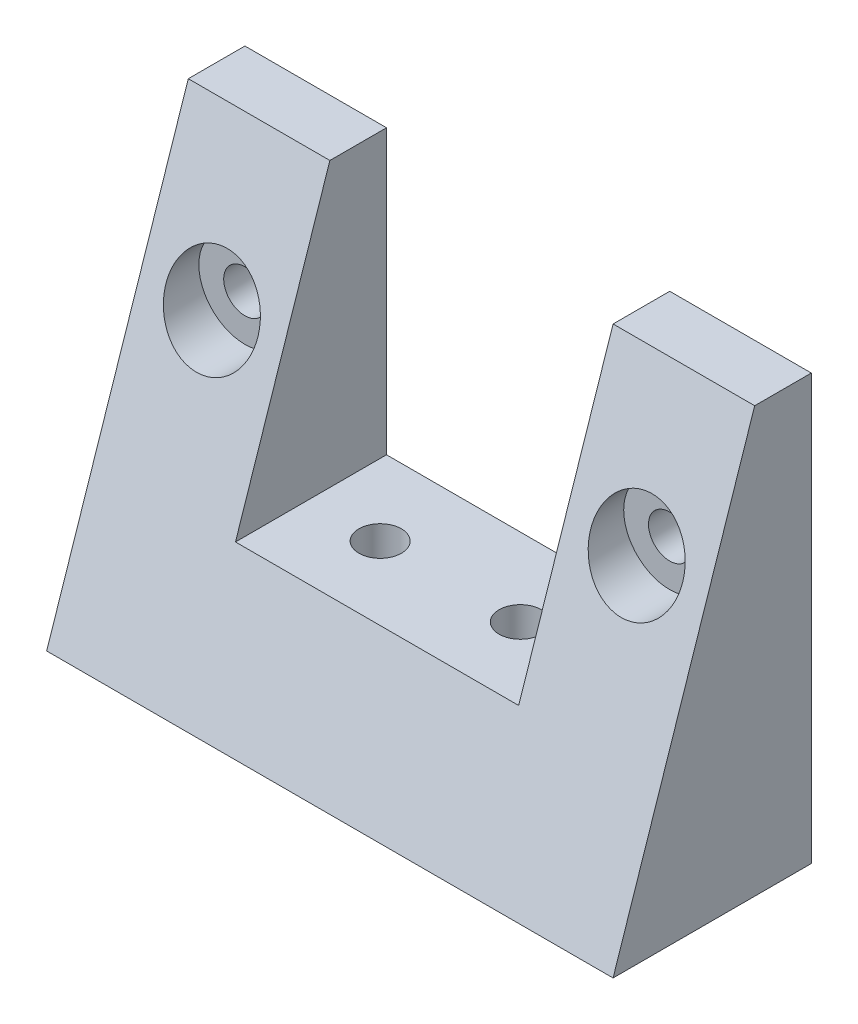
ISO-10303-21;
HEADER;
FILE_DESCRIPTION(('STEP AP214'),'2;1');
FILE_NAME('part.step','',(''),(''),'','','');
FILE_SCHEMA(('AUTOMOTIVE_DESIGN { 1 0 10303 214 1 1 1 1 }'));
ENDSEC;
DATA;
#1=APPLICATION_CONTEXT('core data for automotive mechanical design processes');
#2=APPLICATION_PROTOCOL_DEFINITION('international standard','automotive_design',2000,#1);
#3=PRODUCT_CONTEXT('',#1,'mechanical');
#4=PRODUCT('Part','Part','',(#3));
#5=PRODUCT_RELATED_PRODUCT_CATEGORY('part','',(#4));
#6=PRODUCT_DEFINITION_FORMATION('','',#4);
#7=PRODUCT_DEFINITION_CONTEXT('part definition',#1,'design');
#8=PRODUCT_DEFINITION('design','',#6,#7);
#9=PRODUCT_DEFINITION_SHAPE('','',#8);
#10=(LENGTH_UNIT() NAMED_UNIT(*) SI_UNIT(.MILLI.,.METRE.));
#11=(NAMED_UNIT(*) PLANE_ANGLE_UNIT() SI_UNIT($,.RADIAN.));
#12=(NAMED_UNIT(*) SI_UNIT($,.STERADIAN.) SOLID_ANGLE_UNIT());
#13=UNCERTAINTY_MEASURE_WITH_UNIT(LENGTH_MEASURE(1.E-05),#10,'distance_accuracy_value','');
#14=(GEOMETRIC_REPRESENTATION_CONTEXT(3) GLOBAL_UNCERTAINTY_ASSIGNED_CONTEXT((#13)) GLOBAL_UNIT_ASSIGNED_CONTEXT((#10,
#11,#12)) REPRESENTATION_CONTEXT('',''));
#15=CARTESIAN_POINT('',(0.,0.,0.));
#16=DIRECTION('',(0.,0.,1.));
#17=DIRECTION('',(1.,0.,0.));
#18=AXIS2_PLACEMENT_3D('',#15,#16,#17);
#19=CARTESIAN_POINT('',(-40.,30.,4.));
#20=DIRECTION('',(0.,1.,0.));
#21=DIRECTION('',(0.,0.,1.));
#22=AXIS2_PLACEMENT_3D('',#19,#20,#21);
#23=PLANE('',#22);
#24=DIRECTION('',(0.,0.,-1.));
#25=VECTOR('',#24,1.);
#26=CARTESIAN_POINT('',(-10.,30.,4.));
#27=LINE('',#26,#25);
#28=CARTESIAN_POINT('',(-10.,30.,4.));
#29=VERTEX_POINT('',#28);
#30=CARTESIAN_POINT('',(-10.,30.,0.));
#31=VERTEX_POINT('',#30);
#32=EDGE_CURVE('E48',#29,#31,#27,.T.);
#33=ORIENTED_EDGE('',*,*,#32,.F.);
#34=DIRECTION('',(1.,0.,0.));
#35=VECTOR('',#34,1.);
#36=CARTESIAN_POINT('',(-40.,30.,4.));
#37=LINE('',#36,#35);
#38=CARTESIAN_POINT('',(0.,30.,4.));
#39=VERTEX_POINT('',#38);
#40=EDGE_CURVE('E170',#29,#39,#37,.T.);
#41=ORIENTED_EDGE('',*,*,#40,.T.);
#42=DIRECTION('',(0.,0.,1.));
#43=VECTOR('',#42,1.);
#44=CARTESIAN_POINT('',(0.,30.,4.));
#45=LINE('',#44,#43);
#46=CARTESIAN_POINT('',(0.,30.,0.));
#47=VERTEX_POINT('',#46);
#48=EDGE_CURVE('E155',#47,#39,#45,.T.);
#49=ORIENTED_EDGE('',*,*,#48,.F.);
#50=DIRECTION('',(1.,0.,0.));
#51=VECTOR('',#50,1.);
#52=CARTESIAN_POINT('',(-40.,30.,0.));
#53=LINE('',#52,#51);
#54=EDGE_CURVE('E152',#31,#47,#53,.T.);
#55=ORIENTED_EDGE('',*,*,#54,.F.);
#56=EDGE_LOOP('',(#33,#41,#49,#55));
#57=FACE_BOUND('',#56,.T.);
#58=ADVANCED_FACE('F39',(#57),#23,.T.);
#59=CARTESIAN_POINT('',(-40.,30.,0.));
#60=DIRECTION('',(0.,0.,-1.));
#61=DIRECTION('',(0.,1.,0.));
#62=AXIS2_PLACEMENT_3D('',#59,#60,#61);
#63=PLANE('',#62);
#64=CARTESIAN_POINT('',(-5.,20.,0.));
#65=DIRECTION('',(0.,0.,-1.));
#66=DIRECTION('',(0.,1.,0.));
#67=AXIS2_PLACEMENT_3D('',#64,#65,#66);
#68=CIRCLE('',#67,1.5);
#69=CARTESIAN_POINT('',(-5.,21.5,0.));
#70=VERTEX_POINT('',#69);
#71=EDGE_CURVE('E130',#70,#70,#68,.T.);
#72=ORIENTED_EDGE('',*,*,#71,.F.);
#73=EDGE_LOOP('',(#72));
#74=FACE_BOUND('',#73,.T.);
#75=CARTESIAN_POINT('',(-35.,20.,0.));
#76=DIRECTION('',(0.,0.,-1.));
#77=DIRECTION('',(0.,-1.,0.));
#78=AXIS2_PLACEMENT_3D('',#75,#76,#77);
#79=CIRCLE('',#78,1.5);
#80=CARTESIAN_POINT('',(-35.,18.5,0.));
#81=VERTEX_POINT('',#80);
#82=EDGE_CURVE('E199',#81,#81,#79,.T.);
#83=ORIENTED_EDGE('',*,*,#82,.F.);
#84=EDGE_LOOP('',(#83));
#85=FACE_BOUND('',#84,.T.);
#86=DIRECTION('',(0.,-1.,0.));
#87=VECTOR('',#86,1.);
#88=CARTESIAN_POINT('',(-10.,30.,0.));
#89=LINE('',#88,#87);
#90=CARTESIAN_POINT('',(-10.,10.,0.));
#91=VERTEX_POINT('',#90);
#92=EDGE_CURVE('E126',#31,#91,#89,.T.);
#93=ORIENTED_EDGE('',*,*,#92,.F.);
#94=ORIENTED_EDGE('',*,*,#54,.T.);
#95=DIRECTION('',(0.,1.,0.));
#96=VECTOR('',#95,1.);
#97=CARTESIAN_POINT('',(0.,30.,0.));
#98=LINE('',#97,#96);
#99=CARTESIAN_POINT('',(0.,0.,0.));
#100=VERTEX_POINT('',#99);
#101=EDGE_CURVE('E141',#100,#47,#98,.T.);
#102=ORIENTED_EDGE('',*,*,#101,.F.);
#103=DIRECTION('',(1.,0.,0.));
#104=VECTOR('',#103,1.);
#105=CARTESIAN_POINT('',(-40.,0.,0.));
#106=LINE('',#105,#104);
#107=CARTESIAN_POINT('',(-40.,0.,0.));
#108=VERTEX_POINT('',#107);
#109=EDGE_CURVE('E65',#108,#100,#106,.T.);
#110=ORIENTED_EDGE('',*,*,#109,.F.);
#111=DIRECTION('',(0.,1.,0.));
#112=VECTOR('',#111,1.);
#113=CARTESIAN_POINT('',(-40.,30.,0.));
#114=LINE('',#113,#112);
#115=CARTESIAN_POINT('',(-40.,30.,0.));
#116=VERTEX_POINT('',#115);
#117=EDGE_CURVE('E142',#108,#116,#114,.T.);
#118=ORIENTED_EDGE('',*,*,#117,.T.);
#119=CARTESIAN_POINT('',(-30.,30.,0.));
#120=VERTEX_POINT('',#119);
#121=EDGE_CURVE('E91',#116,#120,#53,.T.);
#122=ORIENTED_EDGE('',*,*,#121,.T.);
#123=DIRECTION('',(0.,1.,0.));
#124=VECTOR('',#123,1.);
#125=CARTESIAN_POINT('',(-30.,30.,0.));
#126=LINE('',#125,#124);
#127=CARTESIAN_POINT('',(-30.,10.,0.));
#128=VERTEX_POINT('',#127);
#129=EDGE_CURVE('E56',#128,#120,#126,.T.);
#130=ORIENTED_EDGE('',*,*,#129,.F.);
#131=DIRECTION('',(-1.,0.,0.));
#132=VECTOR('',#131,1.);
#133=CARTESIAN_POINT('',(-10.,10.,0.));
#134=LINE('',#133,#132);
#135=EDGE_CURVE('E119',#91,#128,#134,.T.);
#136=ORIENTED_EDGE('',*,*,#135,.F.);
#137=EDGE_LOOP('',(#93,#94,#102,#110,#118,#122,#130,#136));
#138=FACE_BOUND('',#137,.T.);
#139=ADVANCED_FACE('F41',(#74,#85,#138),#63,.T.);
#140=CARTESIAN_POINT('',(-40.,0.,0.));
#141=DIRECTION('',(0.,-1.,0.));
#142=DIRECTION('',(0.,0.,-1.));
#143=AXIS2_PLACEMENT_3D('',#140,#141,#142);
#144=PLANE('',#143);
#145=CARTESIAN_POINT('',(-24.95,0.,5.5));
#146=DIRECTION('',(0.,1.,0.));
#147=DIRECTION('',(0.,0.,1.));
#148=AXIS2_PLACEMENT_3D('',#145,#146,#147);
#149=CIRCLE('',#148,1.5);
#150=CARTESIAN_POINT('',(-24.95,0.,7.));
#151=VERTEX_POINT('',#150);
#152=EDGE_CURVE('E201',#151,#151,#149,.T.);
#153=ORIENTED_EDGE('',*,*,#152,.T.);
#154=EDGE_LOOP('',(#153));
#155=FACE_BOUND('',#154,.T.);
#156=CARTESIAN_POINT('',(-15.05,0.,5.5));
#157=DIRECTION('',(0.,1.,0.));
#158=DIRECTION('',(0.,0.,-1.));
#159=AXIS2_PLACEMENT_3D('',#156,#157,#158);
#160=CIRCLE('',#159,1.5);
#161=CARTESIAN_POINT('',(-15.05,0.,4.));
#162=VERTEX_POINT('',#161);
#163=EDGE_CURVE('E189',#162,#162,#160,.T.);
#164=ORIENTED_EDGE('',*,*,#163,.T.);
#165=EDGE_LOOP('',(#164));
#166=FACE_BOUND('',#165,.T.);
#167=DIRECTION('',(0.,0.,-1.));
#168=VECTOR('',#167,1.);
#169=CARTESIAN_POINT('',(0.,0.,0.));
#170=LINE('',#169,#168);
#171=CARTESIAN_POINT('',(0.,0.,14.));
#172=VERTEX_POINT('',#171);
#173=EDGE_CURVE('E145',#172,#100,#170,.T.);
#174=ORIENTED_EDGE('',*,*,#173,.F.);
#175=DIRECTION('',(1.,0.,0.));
#176=VECTOR('',#175,1.);
#177=CARTESIAN_POINT('',(-40.,0.,14.));
#178=LINE('',#177,#176);
#179=CARTESIAN_POINT('',(-40.,0.,14.));
#180=VERTEX_POINT('',#179);
#181=EDGE_CURVE('E165',#180,#172,#178,.T.);
#182=ORIENTED_EDGE('',*,*,#181,.F.);
#183=DIRECTION('',(0.,0.,-1.));
#184=VECTOR('',#183,1.);
#185=CARTESIAN_POINT('',(-40.,0.,0.));
#186=LINE('',#185,#184);
#187=EDGE_CURVE('E150',#180,#108,#186,.T.);
#188=ORIENTED_EDGE('',*,*,#187,.T.);
#189=ORIENTED_EDGE('',*,*,#109,.T.);
#190=EDGE_LOOP('',(#174,#182,#188,#189));
#191=FACE_BOUND('',#190,.T.);
#192=ADVANCED_FACE('F235',(#155,#166,#191),#144,.T.);
#193=CARTESIAN_POINT('',(-40.,0.,14.));
#194=DIRECTION('',(0.,0.316227766016838,0.948683298050514));
#195=DIRECTION('',(0.,-0.948683298050514,0.316227766016838));
#196=AXIS2_PLACEMENT_3D('',#193,#194,#195);
#197=PLANE('',#196);
#198=CARTESIAN_POINT('',(-5.,20.,7.33333333333333));
#199=DIRECTION('',(0.,0.316227766016838,0.948683298050514));
#200=DIRECTION('',(0.,-0.948683298050514,0.316227766016838));
#201=AXIS2_PLACEMENT_3D('',#198,#199,#200);
#202=ELLIPSE('',#201,3.42580079851574,3.25);
#203=CARTESIAN_POINT('',(-5.,16.75,8.41666666666667));
#204=VERTEX_POINT('',#203);
#205=EDGE_CURVE('E43',#204,#204,#202,.F.);
#206=ORIENTED_EDGE('',*,*,#205,.T.);
#207=EDGE_LOOP('',(#206));
#208=FACE_BOUND('',#207,.T.);
#209=CARTESIAN_POINT('',(-35.,20.,7.33333333333333));
#210=DIRECTION('',(0.,0.316227766016838,0.948683298050514));
#211=DIRECTION('',(0.,-0.948683298050514,0.316227766016838));
#212=AXIS2_PLACEMENT_3D('',#209,#210,#211);
#213=ELLIPSE('',#212,3.42580079851574,3.25);
#214=CARTESIAN_POINT('',(-35.,16.75,8.41666666666667));
#215=VERTEX_POINT('',#214);
#216=EDGE_CURVE('E180',#215,#215,#213,.F.);
#217=ORIENTED_EDGE('',*,*,#216,.T.);
#218=EDGE_LOOP('',(#217));
#219=FACE_BOUND('',#218,.T.);
#220=DIRECTION('',(0.,0.948683298050514,-0.316227766016838));
#221=VECTOR('',#220,1.);
#222=CARTESIAN_POINT('',(-10.,0.,14.));
#223=LINE('',#222,#221);
#224=CARTESIAN_POINT('',(-10.,10.,10.6666666666667));
#225=VERTEX_POINT('',#224);
#226=EDGE_CURVE('E139',#225,#29,#223,.T.);
#227=ORIENTED_EDGE('',*,*,#226,.F.);
#228=DIRECTION('',(1.,0.,0.));
#229=VECTOR('',#228,1.);
#230=CARTESIAN_POINT('',(-40.,10.,10.6666666666667));
#231=LINE('',#230,#229);
#232=CARTESIAN_POINT('',(-30.,10.,10.6666666666667));
#233=VERTEX_POINT('',#232);
#234=EDGE_CURVE('E12',#233,#225,#231,.T.);
#235=ORIENTED_EDGE('',*,*,#234,.F.);
#236=DIRECTION('',(0.,-0.948683298050514,0.316227766016838));
#237=VECTOR('',#236,1.);
#238=CARTESIAN_POINT('',(-30.,0.,14.));
#239=LINE('',#238,#237);
#240=CARTESIAN_POINT('',(-30.,30.,4.));
#241=VERTEX_POINT('',#240);
#242=EDGE_CURVE('E136',#241,#233,#239,.T.);
#243=ORIENTED_EDGE('',*,*,#242,.F.);
#244=CARTESIAN_POINT('',(-40.,30.,4.));
#245=VERTEX_POINT('',#244);
#246=EDGE_CURVE('E167',#245,#241,#37,.T.);
#247=ORIENTED_EDGE('',*,*,#246,.F.);
#248=DIRECTION('',(0.,-0.948683298050514,0.316227766016838));
#249=VECTOR('',#248,1.);
#250=CARTESIAN_POINT('',(-40.,0.,14.));
#251=LINE('',#250,#249);
#252=EDGE_CURVE('E147',#245,#180,#251,.T.);
#253=ORIENTED_EDGE('',*,*,#252,.T.);
#254=ORIENTED_EDGE('',*,*,#181,.T.);
#255=DIRECTION('',(0.,-0.948683298050514,0.316227766016838));
#256=VECTOR('',#255,1.);
#257=CARTESIAN_POINT('',(0.,0.,14.));
#258=LINE('',#257,#256);
#259=EDGE_CURVE('E158',#39,#172,#258,.T.);
#260=ORIENTED_EDGE('',*,*,#259,.F.);
#261=ORIENTED_EDGE('',*,*,#40,.F.);
#262=EDGE_LOOP('',(#227,#235,#243,#247,#253,#254,#260,#261));
#263=FACE_BOUND('',#262,.T.);
#264=ADVANCED_FACE('F240',(#208,#219,#263),#197,.T.);
#265=DIRECTION('',(0.,0.,1.));
#266=VECTOR('',#265,1.);
#267=CARTESIAN_POINT('',(-30.,30.,4.));
#268=LINE('',#267,#266);
#269=EDGE_CURVE('E164',#120,#241,#268,.T.);
#270=ORIENTED_EDGE('',*,*,#269,.F.);
#271=ORIENTED_EDGE('',*,*,#121,.F.);
#272=DIRECTION('',(0.,0.,1.));
#273=VECTOR('',#272,1.);
#274=CARTESIAN_POINT('',(-40.,30.,4.));
#275=LINE('',#274,#273);
#276=EDGE_CURVE('E144',#116,#245,#275,.T.);
#277=ORIENTED_EDGE('',*,*,#276,.T.);
#278=ORIENTED_EDGE('',*,*,#246,.T.);
#279=EDGE_LOOP('',(#270,#271,#277,#278));
#280=FACE_BOUND('',#279,.T.);
#281=ADVANCED_FACE('F243',(#280),#23,.T.);
#282=CARTESIAN_POINT('',(-40.,0.,0.));
#283=DIRECTION('',(-1.,0.,0.));
#284=DIRECTION('',(0.,0.,1.));
#285=AXIS2_PLACEMENT_3D('',#282,#283,#284);
#286=PLANE('',#285);
#287=ORIENTED_EDGE('',*,*,#117,.F.);
#288=ORIENTED_EDGE('',*,*,#187,.F.);
#289=ORIENTED_EDGE('',*,*,#252,.F.);
#290=ORIENTED_EDGE('',*,*,#276,.F.);
#291=EDGE_LOOP('',(#287,#288,#289,#290));
#292=FACE_BOUND('',#291,.T.);
#293=ADVANCED_FACE('F248',(#292),#286,.T.);
#294=CARTESIAN_POINT('',(0.,0.,0.));
#295=DIRECTION('',(-1.,0.,0.));
#296=DIRECTION('',(0.,0.,1.));
#297=AXIS2_PLACEMENT_3D('',#294,#295,#296);
#298=PLANE('',#297);
#299=ORIENTED_EDGE('',*,*,#101,.T.);
#300=ORIENTED_EDGE('',*,*,#48,.T.);
#301=ORIENTED_EDGE('',*,*,#259,.T.);
#302=ORIENTED_EDGE('',*,*,#173,.T.);
#303=EDGE_LOOP('',(#299,#300,#301,#302));
#304=FACE_BOUND('',#303,.T.);
#305=ADVANCED_FACE('F253',(#304),#298,.F.);
#306=CARTESIAN_POINT('',(-10.,30.,14.));
#307=DIRECTION('',(1.,0.,0.));
#308=DIRECTION('',(0.,1.,0.));
#309=AXIS2_PLACEMENT_3D('',#306,#307,#308);
#310=PLANE('',#309);
#311=ORIENTED_EDGE('',*,*,#226,.T.);
#312=ORIENTED_EDGE('',*,*,#32,.T.);
#313=ORIENTED_EDGE('',*,*,#92,.T.);
#314=DIRECTION('',(0.,0.,-1.));
#315=VECTOR('',#314,1.);
#316=CARTESIAN_POINT('',(-10.,10.,14.));
#317=LINE('',#316,#315);
#318=EDGE_CURVE('E114',#225,#91,#317,.T.);
#319=ORIENTED_EDGE('',*,*,#318,.F.);
#320=EDGE_LOOP('',(#311,#312,#313,#319));
#321=FACE_BOUND('',#320,.T.);
#322=ADVANCED_FACE('F127',(#321),#310,.F.);
#323=CARTESIAN_POINT('',(-30.,30.,14.));
#324=DIRECTION('',(-1.,0.,0.));
#325=DIRECTION('',(0.,-1.,0.));
#326=AXIS2_PLACEMENT_3D('',#323,#324,#325);
#327=PLANE('',#326);
#328=ORIENTED_EDGE('',*,*,#242,.T.);
#329=DIRECTION('',(0.,0.,-1.));
#330=VECTOR('',#329,1.);
#331=CARTESIAN_POINT('',(-30.,10.,14.));
#332=LINE('',#331,#330);
#333=EDGE_CURVE('E123',#233,#128,#332,.T.);
#334=ORIENTED_EDGE('',*,*,#333,.T.);
#335=ORIENTED_EDGE('',*,*,#129,.T.);
#336=ORIENTED_EDGE('',*,*,#269,.T.);
#337=EDGE_LOOP('',(#328,#334,#335,#336));
#338=FACE_BOUND('',#337,.T.);
#339=ADVANCED_FACE('F261',(#338),#327,.F.);
#340=CARTESIAN_POINT('',(-10.,10.,14.));
#341=DIRECTION('',(0.,-1.,0.));
#342=DIRECTION('',(0.,0.,-1.));
#343=AXIS2_PLACEMENT_3D('',#340,#341,#342);
#344=PLANE('',#343);
#345=CARTESIAN_POINT('',(-24.95,10.,5.5));
#346=DIRECTION('',(0.,1.,0.));
#347=DIRECTION('',(0.,0.,1.));
#348=AXIS2_PLACEMENT_3D('',#345,#346,#347);
#349=CIRCLE('',#348,1.5);
#350=CARTESIAN_POINT('',(-24.95,10.,7.));
#351=VERTEX_POINT('',#350);
#352=EDGE_CURVE('E194',#351,#351,#349,.T.);
#353=ORIENTED_EDGE('',*,*,#352,.F.);
#354=EDGE_LOOP('',(#353));
#355=FACE_BOUND('',#354,.T.);
#356=CARTESIAN_POINT('',(-15.05,10.,5.5));
#357=DIRECTION('',(0.,1.,0.));
#358=DIRECTION('',(0.,0.,-1.));
#359=AXIS2_PLACEMENT_3D('',#356,#357,#358);
#360=CIRCLE('',#359,1.5);
#361=CARTESIAN_POINT('',(-15.05,10.,4.));
#362=VERTEX_POINT('',#361);
#363=EDGE_CURVE('E185',#362,#362,#360,.T.);
#364=ORIENTED_EDGE('',*,*,#363,.F.);
#365=EDGE_LOOP('',(#364));
#366=FACE_BOUND('',#365,.T.);
#367=ORIENTED_EDGE('',*,*,#234,.T.);
#368=ORIENTED_EDGE('',*,*,#318,.T.);
#369=ORIENTED_EDGE('',*,*,#135,.T.);
#370=ORIENTED_EDGE('',*,*,#333,.F.);
#371=EDGE_LOOP('',(#367,#368,#369,#370));
#372=FACE_BOUND('',#371,.T.);
#373=ADVANCED_FACE('F116',(#355,#366,#372),#344,.F.);
#374=CARTESIAN_POINT('',(-35.,20.,14.));
#375=DIRECTION('',(0.,0.,-1.));
#376=DIRECTION('',(0.,1.,0.));
#377=AXIS2_PLACEMENT_3D('',#374,#375,#376);
#378=CYLINDRICAL_SURFACE('',#377,1.5);
#379=CARTESIAN_POINT('',(-35.,20.,5.));
#380=DIRECTION('',(0.,0.,-1.));
#381=DIRECTION('',(0.,1.,0.));
#382=AXIS2_PLACEMENT_3D('',#379,#380,#381);
#383=CIRCLE('',#382,1.5);
#384=CARTESIAN_POINT('',(-35.,21.5,5.));
#385=VERTEX_POINT('',#384);
#386=EDGE_CURVE('E177',#385,#385,#383,.F.);
#387=ORIENTED_EDGE('',*,*,#386,.T.);
#388=EDGE_LOOP('',(#387));
#389=FACE_BOUND('',#388,.T.);
#390=ORIENTED_EDGE('',*,*,#82,.T.);
#391=EDGE_LOOP('',(#390));
#392=FACE_BOUND('',#391,.T.);
#393=ADVANCED_FACE('F229',(#389,#392),#378,.F.);
#394=CARTESIAN_POINT('',(-5.,20.,14.));
#395=DIRECTION('',(0.,0.,-1.));
#396=DIRECTION('',(0.,1.,0.));
#397=AXIS2_PLACEMENT_3D('',#394,#395,#396);
#398=CYLINDRICAL_SURFACE('',#397,1.5);
#399=CARTESIAN_POINT('',(-5.,20.,5.));
#400=DIRECTION('',(0.,0.,-1.));
#401=DIRECTION('',(0.,1.,0.));
#402=AXIS2_PLACEMENT_3D('',#399,#400,#401);
#403=CIRCLE('',#402,1.5);
#404=CARTESIAN_POINT('',(-5.,21.5,5.));
#405=VERTEX_POINT('',#404);
#406=EDGE_CURVE('E174',#405,#405,#403,.F.);
#407=ORIENTED_EDGE('',*,*,#406,.T.);
#408=EDGE_LOOP('',(#407));
#409=FACE_BOUND('',#408,.T.);
#410=ORIENTED_EDGE('',*,*,#71,.T.);
#411=EDGE_LOOP('',(#410));
#412=FACE_BOUND('',#411,.T.);
#413=ADVANCED_FACE('F225',(#409,#412),#398,.F.);
#414=CARTESIAN_POINT('',(-15.05,0.,5.5));
#415=DIRECTION('',(0.,1.,0.));
#416=DIRECTION('',(0.,0.,1.));
#417=AXIS2_PLACEMENT_3D('',#414,#415,#416);
#418=CYLINDRICAL_SURFACE('',#417,1.5);
#419=ORIENTED_EDGE('',*,*,#163,.F.);
#420=EDGE_LOOP('',(#419));
#421=FACE_BOUND('',#420,.T.);
#422=ORIENTED_EDGE('',*,*,#363,.T.);
#423=EDGE_LOOP('',(#422));
#424=FACE_BOUND('',#423,.T.);
#425=ADVANCED_FACE('F228',(#421,#424),#418,.F.);
#426=CARTESIAN_POINT('',(-24.95,0.,5.5));
#427=DIRECTION('',(0.,1.,0.));
#428=DIRECTION('',(0.,0.,1.));
#429=AXIS2_PLACEMENT_3D('',#426,#427,#428);
#430=CYLINDRICAL_SURFACE('',#429,1.5);
#431=ORIENTED_EDGE('',*,*,#152,.F.);
#432=EDGE_LOOP('',(#431));
#433=FACE_BOUND('',#432,.T.);
#434=ORIENTED_EDGE('',*,*,#352,.T.);
#435=EDGE_LOOP('',(#434));
#436=FACE_BOUND('',#435,.T.);
#437=ADVANCED_FACE('F221',(#433,#436),#430,.F.);
#438=CARTESIAN_POINT('',(-40.,30.,5.));
#439=DIRECTION('',(0.,0.,-1.));
#440=DIRECTION('',(0.,1.,0.));
#441=AXIS2_PLACEMENT_3D('',#438,#439,#440);
#442=PLANE('',#441);
#443=CARTESIAN_POINT('',(-5.,20.,5.));
#444=DIRECTION('',(0.,0.,-1.));
#445=DIRECTION('',(0.,1.,0.));
#446=AXIS2_PLACEMENT_3D('',#443,#444,#445);
#447=CIRCLE('',#446,3.25);
#448=CARTESIAN_POINT('',(-5.,23.25,5.));
#449=VERTEX_POINT('',#448);
#450=EDGE_CURVE('E178',#449,#449,#447,.T.);
#451=ORIENTED_EDGE('',*,*,#450,.F.);
#452=EDGE_LOOP('',(#451));
#453=FACE_BOUND('',#452,.T.);
#454=ORIENTED_EDGE('',*,*,#406,.F.);
#455=EDGE_LOOP('',(#454));
#456=FACE_BOUND('',#455,.T.);
#457=ADVANCED_FACE('F218',(#453,#456),#442,.F.);
#458=CARTESIAN_POINT('',(-5.,20.,-9.19238815542512));
#459=DIRECTION('',(0.,0.,1.));
#460=DIRECTION('',(0.,-1.,0.));
#461=AXIS2_PLACEMENT_3D('',#458,#459,#460);
#462=CYLINDRICAL_SURFACE('',#461,3.25);
#463=ORIENTED_EDGE('',*,*,#205,.F.);
#464=EDGE_LOOP('',(#463));
#465=FACE_BOUND('',#464,.T.);
#466=ORIENTED_EDGE('',*,*,#450,.T.);
#467=EDGE_LOOP('',(#466));
#468=FACE_BOUND('',#467,.T.);
#469=ADVANCED_FACE('F216',(#465,#468),#462,.F.);
#470=CARTESIAN_POINT('',(-40.,30.,5.));
#471=DIRECTION('',(0.,0.,-1.));
#472=DIRECTION('',(0.,1.,0.));
#473=AXIS2_PLACEMENT_3D('',#470,#471,#472);
#474=PLANE('',#473);
#475=CARTESIAN_POINT('',(-35.,20.,5.));
#476=DIRECTION('',(0.,0.,-1.));
#477=DIRECTION('',(0.,1.,0.));
#478=AXIS2_PLACEMENT_3D('',#475,#476,#477);
#479=CIRCLE('',#478,3.25);
#480=CARTESIAN_POINT('',(-35.,23.25,5.));
#481=VERTEX_POINT('',#480);
#482=EDGE_CURVE('E210',#481,#481,#479,.T.);
#483=ORIENTED_EDGE('',*,*,#482,.F.);
#484=EDGE_LOOP('',(#483));
#485=FACE_BOUND('',#484,.T.);
#486=ORIENTED_EDGE('',*,*,#386,.F.);
#487=EDGE_LOOP('',(#486));
#488=FACE_BOUND('',#487,.T.);
#489=ADVANCED_FACE('F361',(#485,#488),#474,.F.);
#490=CARTESIAN_POINT('',(-35.,20.,-9.19238815542512));
#491=DIRECTION('',(0.,0.,1.));
#492=DIRECTION('',(0.,-1.,0.));
#493=AXIS2_PLACEMENT_3D('',#490,#491,#492);
#494=CYLINDRICAL_SURFACE('',#493,3.25);
#495=ORIENTED_EDGE('',*,*,#216,.F.);
#496=EDGE_LOOP('',(#495));
#497=FACE_BOUND('',#496,.T.);
#498=ORIENTED_EDGE('',*,*,#482,.T.);
#499=EDGE_LOOP('',(#498));
#500=FACE_BOUND('',#499,.T.);
#501=ADVANCED_FACE('F371',(#497,#500),#494,.F.);
#502=CLOSED_SHELL('',(#58,#139,#192,#264,#281,#293,#305,#322,#339,#373,#393,#413,#425,#437,#457,
#469,#489,#501));
#503=MANIFOLD_SOLID_BREP('B2',#502);
#504=ADVANCED_BREP_SHAPE_REPRESENTATION('',(#18,#503),#14);
#505=SHAPE_DEFINITION_REPRESENTATION(#9,#504);
ENDSEC;
END-ISO-10303-21;
